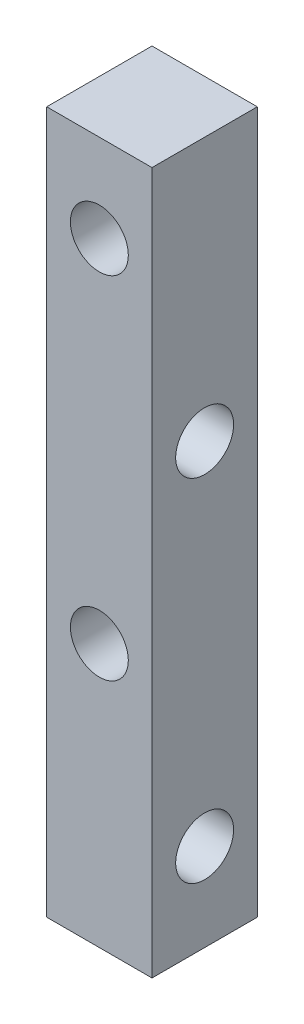
ISO-10303-21;
HEADER;
FILE_DESCRIPTION(('STEP AP214'),'2;1');
FILE_NAME('part.step','',(''),(''),'','','');
FILE_SCHEMA(('AUTOMOTIVE_DESIGN { 1 0 10303 214 1 1 1 1 }'));
ENDSEC;
DATA;
#1=APPLICATION_CONTEXT('core data for automotive mechanical design processes');
#2=APPLICATION_PROTOCOL_DEFINITION('international standard','automotive_design',2000,#1);
#3=PRODUCT_CONTEXT('',#1,'mechanical');
#4=PRODUCT('Part','Part','',(#3));
#5=PRODUCT_RELATED_PRODUCT_CATEGORY('part','',(#4));
#6=PRODUCT_DEFINITION_FORMATION('','',#4);
#7=PRODUCT_DEFINITION_CONTEXT('part definition',#1,'design');
#8=PRODUCT_DEFINITION('design','',#6,#7);
#9=PRODUCT_DEFINITION_SHAPE('','',#8);
#10=(LENGTH_UNIT() NAMED_UNIT(*) SI_UNIT(.MILLI.,.METRE.));
#11=(NAMED_UNIT(*) PLANE_ANGLE_UNIT() SI_UNIT($,.RADIAN.));
#12=(NAMED_UNIT(*) SI_UNIT($,.STERADIAN.) SOLID_ANGLE_UNIT());
#13=UNCERTAINTY_MEASURE_WITH_UNIT(LENGTH_MEASURE(1.E-05),#10,'distance_accuracy_value','');
#14=(GEOMETRIC_REPRESENTATION_CONTEXT(3) GLOBAL_UNCERTAINTY_ASSIGNED_CONTEXT((#13)) GLOBAL_UNIT_ASSIGNED_CONTEXT((#10,
#11,#12)) REPRESENTATION_CONTEXT('',''));
#15=CARTESIAN_POINT('',(0.,0.,0.));
#16=DIRECTION('',(0.,0.,1.));
#17=DIRECTION('',(1.,0.,0.));
#18=AXIS2_PLACEMENT_3D('',#15,#16,#17);
#19=CARTESIAN_POINT('',(3.,20.,-3.));
#20=DIRECTION('',(-1.,0.,0.));
#21=DIRECTION('',(0.,0.,1.));
#22=AXIS2_PLACEMENT_3D('',#19,#20,#21);
#23=PLANE('',#22);
#24=CARTESIAN_POINT('',(3.,5.,0.));
#25=DIRECTION('',(-1.,0.,0.));
#26=DIRECTION('',(0.,0.,1.));
#27=AXIS2_PLACEMENT_3D('',#24,#25,#26);
#28=CIRCLE('',#27,1.65);
#29=CARTESIAN_POINT('',(3.,5.,-1.65));
#30=VERTEX_POINT('',#29);
#31=EDGE_CURVE('E124',#30,#30,#28,.T.);
#32=ORIENTED_EDGE('',*,*,#31,.T.);
#33=EDGE_LOOP('',(#32));
#34=FACE_BOUND('',#33,.T.);
#35=CARTESIAN_POINT('',(3.,-15.,0.));
#36=DIRECTION('',(-1.,0.,0.));
#37=DIRECTION('',(0.,0.,1.));
#38=AXIS2_PLACEMENT_3D('',#35,#36,#37);
#39=CIRCLE('',#38,1.65);
#40=CARTESIAN_POINT('',(3.,-15.,-1.65));
#41=VERTEX_POINT('',#40);
#42=EDGE_CURVE('E129',#41,#41,#39,.T.);
#43=ORIENTED_EDGE('',*,*,#42,.T.);
#44=EDGE_LOOP('',(#43));
#45=FACE_BOUND('',#44,.T.);
#46=DIRECTION('',(0.,0.,-1.));
#47=VECTOR('',#46,1.);
#48=CARTESIAN_POINT('',(3.,-20.,-3.));
#49=LINE('',#48,#47);
#50=CARTESIAN_POINT('',(3.,-20.,3.));
#51=VERTEX_POINT('',#50);
#52=CARTESIAN_POINT('',(3.,-20.,-3.));
#53=VERTEX_POINT('',#52);
#54=EDGE_CURVE('E105',#51,#53,#49,.T.);
#55=ORIENTED_EDGE('',*,*,#54,.T.);
#56=DIRECTION('',(0.,-1.,0.));
#57=VECTOR('',#56,1.);
#58=CARTESIAN_POINT('',(3.,20.,-3.));
#59=LINE('',#58,#57);
#60=CARTESIAN_POINT('',(3.,20.,-3.));
#61=VERTEX_POINT('',#60);
#62=EDGE_CURVE('E11',#61,#53,#59,.T.);
#63=ORIENTED_EDGE('',*,*,#62,.F.);
#64=DIRECTION('',(0.,0.,-1.));
#65=VECTOR('',#64,1.);
#66=CARTESIAN_POINT('',(3.,20.,-3.));
#67=LINE('',#66,#65);
#68=CARTESIAN_POINT('',(3.,20.,3.));
#69=VERTEX_POINT('',#68);
#70=EDGE_CURVE('E92',#69,#61,#67,.T.);
#71=ORIENTED_EDGE('',*,*,#70,.F.);
#72=DIRECTION('',(0.,-1.,0.));
#73=VECTOR('',#72,1.);
#74=CARTESIAN_POINT('',(3.,20.,3.));
#75=LINE('',#74,#73);
#76=EDGE_CURVE('E101',#69,#51,#75,.T.);
#77=ORIENTED_EDGE('',*,*,#76,.T.);
#78=EDGE_LOOP('',(#55,#63,#71,#77));
#79=FACE_BOUND('',#78,.T.);
#80=ADVANCED_FACE('F39',(#34,#45,#79),#23,.F.);
#81=CARTESIAN_POINT('',(-3.,20.,-3.));
#82=DIRECTION('',(0.,0.,1.));
#83=DIRECTION('',(1.,0.,0.));
#84=AXIS2_PLACEMENT_3D('',#81,#82,#83);
#85=PLANE('',#84);
#86=CARTESIAN_POINT('',(0.,15.,-3.));
#87=DIRECTION('',(0.,0.,1.));
#88=DIRECTION('',(1.,0.,0.));
#89=AXIS2_PLACEMENT_3D('',#86,#87,#88);
#90=CIRCLE('',#89,1.65);
#91=CARTESIAN_POINT('',(1.65,15.,-3.));
#92=VERTEX_POINT('',#91);
#93=EDGE_CURVE('E114',#92,#92,#90,.T.);
#94=ORIENTED_EDGE('',*,*,#93,.T.);
#95=EDGE_LOOP('',(#94));
#96=FACE_BOUND('',#95,.T.);
#97=CARTESIAN_POINT('',(0.,-5.,-3.));
#98=DIRECTION('',(0.,0.,1.));
#99=DIRECTION('',(1.,0.,0.));
#100=AXIS2_PLACEMENT_3D('',#97,#98,#99);
#101=CIRCLE('',#100,1.65);
#102=CARTESIAN_POINT('',(1.65,-5.,-3.));
#103=VERTEX_POINT('',#102);
#104=EDGE_CURVE('E119',#103,#103,#101,.T.);
#105=ORIENTED_EDGE('',*,*,#104,.T.);
#106=EDGE_LOOP('',(#105));
#107=FACE_BOUND('',#106,.T.);
#108=DIRECTION('',(-1.,0.,0.));
#109=VECTOR('',#108,1.);
#110=CARTESIAN_POINT('',(-3.,-20.,-3.));
#111=LINE('',#110,#109);
#112=CARTESIAN_POINT('',(-3.,-20.,-3.));
#113=VERTEX_POINT('',#112);
#114=EDGE_CURVE('E96',#53,#113,#111,.T.);
#115=ORIENTED_EDGE('',*,*,#114,.T.);
#116=DIRECTION('',(0.,-1.,0.));
#117=VECTOR('',#116,1.);
#118=CARTESIAN_POINT('',(-3.,20.,-3.));
#119=LINE('',#118,#117);
#120=CARTESIAN_POINT('',(-3.,20.,-3.));
#121=VERTEX_POINT('',#120);
#122=EDGE_CURVE('E48',#121,#113,#119,.T.);
#123=ORIENTED_EDGE('',*,*,#122,.F.);
#124=DIRECTION('',(-1.,0.,0.));
#125=VECTOR('',#124,1.);
#126=CARTESIAN_POINT('',(-3.,20.,-3.));
#127=LINE('',#126,#125);
#128=EDGE_CURVE('E87',#61,#121,#127,.T.);
#129=ORIENTED_EDGE('',*,*,#128,.F.);
#130=ORIENTED_EDGE('',*,*,#62,.T.);
#131=EDGE_LOOP('',(#115,#123,#129,#130));
#132=FACE_BOUND('',#131,.T.);
#133=ADVANCED_FACE('F95',(#96,#107,#132),#85,.F.);
#134=CARTESIAN_POINT('',(-3.,20.,-3.));
#135=DIRECTION('',(1.,0.,0.));
#136=DIRECTION('',(0.,0.,-1.));
#137=AXIS2_PLACEMENT_3D('',#134,#135,#136);
#138=PLANE('',#137);
#139=CARTESIAN_POINT('',(-3.,5.,0.));
#140=DIRECTION('',(1.,0.,0.));
#141=DIRECTION('',(0.,0.,-1.));
#142=AXIS2_PLACEMENT_3D('',#139,#140,#141);
#143=CIRCLE('',#142,1.65);
#144=CARTESIAN_POINT('',(-3.,5.,-1.65));
#145=VERTEX_POINT('',#144);
#146=EDGE_CURVE('E132',#145,#145,#143,.T.);
#147=ORIENTED_EDGE('',*,*,#146,.T.);
#148=EDGE_LOOP('',(#147));
#149=FACE_BOUND('',#148,.T.);
#150=CARTESIAN_POINT('',(-3.,-15.,0.));
#151=DIRECTION('',(1.,0.,0.));
#152=DIRECTION('',(0.,0.,-1.));
#153=AXIS2_PLACEMENT_3D('',#150,#151,#152);
#154=CIRCLE('',#153,1.65);
#155=CARTESIAN_POINT('',(-3.,-15.,-1.65));
#156=VERTEX_POINT('',#155);
#157=EDGE_CURVE('E133',#156,#156,#154,.T.);
#158=ORIENTED_EDGE('',*,*,#157,.T.);
#159=EDGE_LOOP('',(#158));
#160=FACE_BOUND('',#159,.T.);
#161=DIRECTION('',(0.,0.,1.));
#162=VECTOR('',#161,1.);
#163=CARTESIAN_POINT('',(-3.,-20.,-3.));
#164=LINE('',#163,#162);
#165=CARTESIAN_POINT('',(-3.,-20.,3.));
#166=VERTEX_POINT('',#165);
#167=EDGE_CURVE('E74',#113,#166,#164,.T.);
#168=ORIENTED_EDGE('',*,*,#167,.T.);
#169=DIRECTION('',(0.,-1.,0.));
#170=VECTOR('',#169,1.);
#171=CARTESIAN_POINT('',(-3.,20.,3.));
#172=LINE('',#171,#170);
#173=CARTESIAN_POINT('',(-3.,20.,3.));
#174=VERTEX_POINT('',#173);
#175=EDGE_CURVE('E97',#174,#166,#172,.T.);
#176=ORIENTED_EDGE('',*,*,#175,.F.);
#177=DIRECTION('',(0.,0.,1.));
#178=VECTOR('',#177,1.);
#179=CARTESIAN_POINT('',(-3.,20.,-3.));
#180=LINE('',#179,#178);
#181=EDGE_CURVE('E90',#121,#174,#180,.T.);
#182=ORIENTED_EDGE('',*,*,#181,.F.);
#183=ORIENTED_EDGE('',*,*,#122,.T.);
#184=EDGE_LOOP('',(#168,#176,#182,#183));
#185=FACE_BOUND('',#184,.T.);
#186=ADVANCED_FACE('F99',(#149,#160,#185),#138,.F.);
#187=CARTESIAN_POINT('',(-3.,20.,3.));
#188=DIRECTION('',(0.,0.,-1.));
#189=DIRECTION('',(-1.,0.,0.));
#190=AXIS2_PLACEMENT_3D('',#187,#188,#189);
#191=PLANE('',#190);
#192=CARTESIAN_POINT('',(0.,15.,3.));
#193=DIRECTION('',(0.,0.,-1.));
#194=DIRECTION('',(-1.,0.,0.));
#195=AXIS2_PLACEMENT_3D('',#192,#193,#194);
#196=CIRCLE('',#195,1.65);
#197=CARTESIAN_POINT('',(-1.65,15.,3.));
#198=VERTEX_POINT('',#197);
#199=EDGE_CURVE('E42',#198,#198,#196,.T.);
#200=ORIENTED_EDGE('',*,*,#199,.T.);
#201=EDGE_LOOP('',(#200));
#202=FACE_BOUND('',#201,.T.);
#203=CARTESIAN_POINT('',(0.,-5.,3.));
#204=DIRECTION('',(0.,0.,-1.));
#205=DIRECTION('',(-1.,0.,0.));
#206=AXIS2_PLACEMENT_3D('',#203,#204,#205);
#207=CIRCLE('',#206,1.65);
#208=CARTESIAN_POINT('',(-1.65,-5.,3.));
#209=VERTEX_POINT('',#208);
#210=EDGE_CURVE('E112',#209,#209,#207,.T.);
#211=ORIENTED_EDGE('',*,*,#210,.T.);
#212=EDGE_LOOP('',(#211));
#213=FACE_BOUND('',#212,.T.);
#214=DIRECTION('',(1.,0.,0.));
#215=VECTOR('',#214,1.);
#216=CARTESIAN_POINT('',(-3.,-20.,3.));
#217=LINE('',#216,#215);
#218=EDGE_CURVE('E80',#166,#51,#217,.T.);
#219=ORIENTED_EDGE('',*,*,#218,.T.);
#220=ORIENTED_EDGE('',*,*,#76,.F.);
#221=DIRECTION('',(1.,0.,0.));
#222=VECTOR('',#221,1.);
#223=CARTESIAN_POINT('',(-3.,20.,3.));
#224=LINE('',#223,#222);
#225=EDGE_CURVE('E57',#174,#69,#224,.T.);
#226=ORIENTED_EDGE('',*,*,#225,.F.);
#227=ORIENTED_EDGE('',*,*,#175,.T.);
#228=EDGE_LOOP('',(#219,#220,#226,#227));
#229=FACE_BOUND('',#228,.T.);
#230=ADVANCED_FACE('F166',(#202,#213,#229),#191,.F.);
#231=CARTESIAN_POINT('',(0.,20.,0.));
#232=DIRECTION('',(0.,1.,0.));
#233=DIRECTION('',(0.,0.,1.));
#234=AXIS2_PLACEMENT_3D('',#231,#232,#233);
#235=PLANE('',#234);
#236=ORIENTED_EDGE('',*,*,#70,.T.);
#237=ORIENTED_EDGE('',*,*,#128,.T.);
#238=ORIENTED_EDGE('',*,*,#181,.T.);
#239=ORIENTED_EDGE('',*,*,#225,.T.);
#240=EDGE_LOOP('',(#236,#237,#238,#239));
#241=FACE_BOUND('',#240,.T.);
#242=ADVANCED_FACE('F88',(#241),#235,.T.);
#243=CARTESIAN_POINT('',(0.,-20.,0.));
#244=DIRECTION('',(0.,1.,0.));
#245=DIRECTION('',(0.,0.,1.));
#246=AXIS2_PLACEMENT_3D('',#243,#244,#245);
#247=PLANE('',#246);
#248=ORIENTED_EDGE('',*,*,#54,.F.);
#249=ORIENTED_EDGE('',*,*,#218,.F.);
#250=ORIENTED_EDGE('',*,*,#167,.F.);
#251=ORIENTED_EDGE('',*,*,#114,.F.);
#252=EDGE_LOOP('',(#248,#249,#250,#251));
#253=FACE_BOUND('',#252,.T.);
#254=ADVANCED_FACE('F154',(#253),#247,.F.);
#255=CARTESIAN_POINT('',(0.,-5.,-3.));
#256=DIRECTION('',(0.,0.,1.));
#257=DIRECTION('',(1.,0.,0.));
#258=AXIS2_PLACEMENT_3D('',#255,#256,#257);
#259=CYLINDRICAL_SURFACE('',#258,1.65);
#260=ORIENTED_EDGE('',*,*,#104,.F.);
#261=EDGE_LOOP('',(#260));
#262=FACE_BOUND('',#261,.T.);
#263=ORIENTED_EDGE('',*,*,#210,.F.);
#264=EDGE_LOOP('',(#263));
#265=FACE_BOUND('',#264,.T.);
#266=ADVANCED_FACE('F156',(#262,#265),#259,.F.);
#267=CARTESIAN_POINT('',(0.,15.,-3.));
#268=DIRECTION('',(0.,0.,1.));
#269=DIRECTION('',(1.,0.,0.));
#270=AXIS2_PLACEMENT_3D('',#267,#268,#269);
#271=CYLINDRICAL_SURFACE('',#270,1.65);
#272=ORIENTED_EDGE('',*,*,#93,.F.);
#273=EDGE_LOOP('',(#272));
#274=FACE_BOUND('',#273,.T.);
#275=ORIENTED_EDGE('',*,*,#199,.F.);
#276=EDGE_LOOP('',(#275));
#277=FACE_BOUND('',#276,.T.);
#278=ADVANCED_FACE('F163',(#274,#277),#271,.F.);
#279=CARTESIAN_POINT('',(-3.,-15.,0.));
#280=DIRECTION('',(1.,0.,0.));
#281=DIRECTION('',(0.,0.,-1.));
#282=AXIS2_PLACEMENT_3D('',#279,#280,#281);
#283=CYLINDRICAL_SURFACE('',#282,1.65);
#284=CARTESIAN_POINT('',(-3.,-15.,-1.65));
#285=CARTESIAN_POINT('',(-2.9375,-15.,-1.65));
#286=CARTESIAN_POINT('',(-2.875,-15.,-1.65));
#287=CARTESIAN_POINT('',(-2.75,-15.,-1.65));
#288=CARTESIAN_POINT('',(-2.6875,-15.,-1.65));
#289=CARTESIAN_POINT('',(-2.5625,-15.,-1.65));
#290=CARTESIAN_POINT('',(-2.5,-15.,-1.65));
#291=CARTESIAN_POINT('',(-2.375,-15.,-1.65));
#292=CARTESIAN_POINT('',(-2.3125,-15.,-1.65));
#293=CARTESIAN_POINT('',(-2.1875,-15.,-1.65));
#294=CARTESIAN_POINT('',(-2.125,-15.,-1.65));
#295=CARTESIAN_POINT('',(-2.,-15.,-1.65));
#296=CARTESIAN_POINT('',(-1.9375,-15.,-1.65));
#297=CARTESIAN_POINT('',(-1.8125,-15.,-1.65));
#298=CARTESIAN_POINT('',(-1.75,-15.,-1.65));
#299=CARTESIAN_POINT('',(-1.625,-15.,-1.65));
#300=CARTESIAN_POINT('',(-1.5625,-15.,-1.65));
#301=CARTESIAN_POINT('',(-1.4375,-15.,-1.65));
#302=CARTESIAN_POINT('',(-1.375,-15.,-1.65));
#303=CARTESIAN_POINT('',(-1.25,-15.,-1.65));
#304=CARTESIAN_POINT('',(-1.1875,-15.,-1.65));
#305=CARTESIAN_POINT('',(-1.0625,-15.,-1.65));
#306=CARTESIAN_POINT('',(-1.,-15.,-1.65));
#307=CARTESIAN_POINT('',(-0.875000000000001,-15.,-1.65));
#308=CARTESIAN_POINT('',(-0.812500000000001,-15.,-1.65));
#309=CARTESIAN_POINT('',(-0.687500000000001,-15.,-1.65));
#310=CARTESIAN_POINT('',(-0.625000000000001,-15.,-1.65));
#311=CARTESIAN_POINT('',(-0.500000000000001,-15.,-1.65));
#312=CARTESIAN_POINT('',(-0.437500000000001,-15.,-1.65));
#313=CARTESIAN_POINT('',(-0.312500000000001,-15.,-1.65));
#314=CARTESIAN_POINT('',(-0.250000000000001,-15.,-1.65));
#315=CARTESIAN_POINT('',(-0.125000000000001,-15.,-1.65));
#316=CARTESIAN_POINT('',(-0.0625000000000013,-15.,-1.65));
#317=CARTESIAN_POINT('',(0.0624999999999987,-15.,-1.65));
#318=CARTESIAN_POINT('',(0.124999999999999,-15.,-1.65));
#319=CARTESIAN_POINT('',(0.249999999999999,-15.,-1.65));
#320=CARTESIAN_POINT('',(0.312499999999999,-15.,-1.65));
#321=CARTESIAN_POINT('',(0.437499999999999,-15.,-1.65));
#322=CARTESIAN_POINT('',(0.499999999999999,-15.,-1.65));
#323=CARTESIAN_POINT('',(0.624999999999999,-15.,-1.65));
#324=CARTESIAN_POINT('',(0.687499999999999,-15.,-1.65));
#325=CARTESIAN_POINT('',(0.812499999999998,-15.,-1.65));
#326=CARTESIAN_POINT('',(0.874999999999998,-15.,-1.65));
#327=CARTESIAN_POINT('',(0.999999999999998,-15.,-1.65));
#328=CARTESIAN_POINT('',(1.0625,-15.,-1.65));
#329=CARTESIAN_POINT('',(1.1875,-15.,-1.65));
#330=CARTESIAN_POINT('',(1.25,-15.,-1.65));
#331=CARTESIAN_POINT('',(1.375,-15.,-1.65));
#332=CARTESIAN_POINT('',(1.4375,-15.,-1.65));
#333=CARTESIAN_POINT('',(1.5625,-15.,-1.65));
#334=CARTESIAN_POINT('',(1.625,-15.,-1.65));
#335=CARTESIAN_POINT('',(1.75,-15.,-1.65));
#336=CARTESIAN_POINT('',(1.8125,-15.,-1.65));
#337=CARTESIAN_POINT('',(1.9375,-15.,-1.65));
#338=CARTESIAN_POINT('',(2.,-15.,-1.65));
#339=CARTESIAN_POINT('',(2.125,-15.,-1.65));
#340=CARTESIAN_POINT('',(2.1875,-15.,-1.65));
#341=CARTESIAN_POINT('',(2.3125,-15.,-1.65));
#342=CARTESIAN_POINT('',(2.375,-15.,-1.65));
#343=CARTESIAN_POINT('',(2.5,-15.,-1.65));
#344=CARTESIAN_POINT('',(2.5625,-15.,-1.65));
#345=CARTESIAN_POINT('',(2.6875,-15.,-1.65));
#346=CARTESIAN_POINT('',(2.75,-15.,-1.65));
#347=CARTESIAN_POINT('',(2.875,-15.,-1.65));
#348=CARTESIAN_POINT('',(2.9375,-15.,-1.65));
#349=CARTESIAN_POINT('',(3.,-15.,-1.65));
#350=B_SPLINE_CURVE_WITH_KNOTS('',3,(#284,#285,#286,#287,#288,#289,#290,#291,#292,#293,#294,
#295,#296,#297,#298,#299,#300,#301,#302,#303,#304,#305,#306,#307,#308,#309,#310,#311,#312,#313,
#314,#315,#316,#317,#318,#319,#320,#321,#322,#323,#324,#325,#326,#327,#328,#329,#330,#331,#332,
#333,#334,#335,#336,#337,#338,#339,#340,#341,#342,#343,#344,#345,#346,#347,#348,#349),
.UNSPECIFIED.,.F.,.F.,(4,2,2,2,2,2,2,2,2,2,2,2,2,2,2,2,2,2,2,2,2,2,2,2,2,2,2,2,2,2,2,2,4),(0.,
0.1875,0.375,0.5625,0.75,0.9375,1.125,1.3125,1.5,1.6875,1.875,2.0625,2.25,2.4375,2.625,2.8125,
3.,3.1875,3.375,3.5625,3.75,3.9375,4.125,4.3125,4.5,4.6875,4.875,5.0625,5.25,5.4375,5.625,
5.8125,6.),.UNSPECIFIED.);
#351=EDGE_CURVE('BSEAM144',#156,#41,#350,.T.);
#352=ORIENTED_EDGE('',*,*,#157,.F.);
#353=ORIENTED_EDGE('',*,*,#42,.F.);
#354=ORIENTED_EDGE('',*,*,#351,.T.);
#355=ORIENTED_EDGE('',*,*,#351,.F.);
#356=EDGE_LOOP('',(#352,#354,#353,#355));
#357=FACE_BOUND('',#356,.T.);
#358=ADVANCED_FACE('F144',(#357),#283,.F.);
#359=CARTESIAN_POINT('',(-3.,5.,0.));
#360=DIRECTION('',(1.,0.,0.));
#361=DIRECTION('',(0.,0.,-1.));
#362=AXIS2_PLACEMENT_3D('',#359,#360,#361);
#363=CYLINDRICAL_SURFACE('',#362,1.65);
#364=CARTESIAN_POINT('',(-3.,5.,-1.65));
#365=CARTESIAN_POINT('',(-2.9375,5.,-1.65));
#366=CARTESIAN_POINT('',(-2.875,5.,-1.65));
#367=CARTESIAN_POINT('',(-2.75,5.,-1.65));
#368=CARTESIAN_POINT('',(-2.6875,5.,-1.65));
#369=CARTESIAN_POINT('',(-2.5625,5.,-1.65));
#370=CARTESIAN_POINT('',(-2.5,5.,-1.65));
#371=CARTESIAN_POINT('',(-2.375,5.,-1.65));
#372=CARTESIAN_POINT('',(-2.3125,5.,-1.65));
#373=CARTESIAN_POINT('',(-2.1875,5.,-1.65));
#374=CARTESIAN_POINT('',(-2.125,5.,-1.65));
#375=CARTESIAN_POINT('',(-2.,5.,-1.65));
#376=CARTESIAN_POINT('',(-1.9375,5.,-1.65));
#377=CARTESIAN_POINT('',(-1.8125,5.,-1.65));
#378=CARTESIAN_POINT('',(-1.75,5.,-1.65));
#379=CARTESIAN_POINT('',(-1.625,5.,-1.65));
#380=CARTESIAN_POINT('',(-1.5625,5.,-1.65));
#381=CARTESIAN_POINT('',(-1.4375,5.,-1.65));
#382=CARTESIAN_POINT('',(-1.375,5.,-1.65));
#383=CARTESIAN_POINT('',(-1.25,5.,-1.65));
#384=CARTESIAN_POINT('',(-1.1875,5.,-1.65));
#385=CARTESIAN_POINT('',(-1.0625,5.,-1.65));
#386=CARTESIAN_POINT('',(-1.,5.,-1.65));
#387=CARTESIAN_POINT('',(-0.875000000000001,5.,-1.65));
#388=CARTESIAN_POINT('',(-0.812500000000001,5.,-1.65));
#389=CARTESIAN_POINT('',(-0.687500000000001,5.,-1.65));
#390=CARTESIAN_POINT('',(-0.625000000000001,5.,-1.65));
#391=CARTESIAN_POINT('',(-0.500000000000001,5.,-1.65));
#392=CARTESIAN_POINT('',(-0.437500000000001,5.,-1.65));
#393=CARTESIAN_POINT('',(-0.312500000000001,5.,-1.65));
#394=CARTESIAN_POINT('',(-0.250000000000001,5.,-1.65));
#395=CARTESIAN_POINT('',(-0.125000000000001,5.,-1.65));
#396=CARTESIAN_POINT('',(-0.0625000000000013,5.,-1.65));
#397=CARTESIAN_POINT('',(0.0624999999999987,5.,-1.65));
#398=CARTESIAN_POINT('',(0.124999999999999,5.,-1.65));
#399=CARTESIAN_POINT('',(0.249999999999999,5.,-1.65));
#400=CARTESIAN_POINT('',(0.312499999999999,5.,-1.65));
#401=CARTESIAN_POINT('',(0.437499999999999,5.,-1.65));
#402=CARTESIAN_POINT('',(0.499999999999999,5.,-1.65));
#403=CARTESIAN_POINT('',(0.624999999999999,5.,-1.65));
#404=CARTESIAN_POINT('',(0.687499999999999,5.,-1.65));
#405=CARTESIAN_POINT('',(0.812499999999998,5.,-1.65));
#406=CARTESIAN_POINT('',(0.874999999999998,5.,-1.65));
#407=CARTESIAN_POINT('',(0.999999999999998,5.,-1.65));
#408=CARTESIAN_POINT('',(1.0625,5.,-1.65));
#409=CARTESIAN_POINT('',(1.1875,5.,-1.65));
#410=CARTESIAN_POINT('',(1.25,5.,-1.65));
#411=CARTESIAN_POINT('',(1.375,5.,-1.65));
#412=CARTESIAN_POINT('',(1.4375,5.,-1.65));
#413=CARTESIAN_POINT('',(1.5625,5.,-1.65));
#414=CARTESIAN_POINT('',(1.625,5.,-1.65));
#415=CARTESIAN_POINT('',(1.75,5.,-1.65));
#416=CARTESIAN_POINT('',(1.8125,5.,-1.65));
#417=CARTESIAN_POINT('',(1.9375,5.,-1.65));
#418=CARTESIAN_POINT('',(2.,5.,-1.65));
#419=CARTESIAN_POINT('',(2.125,5.,-1.65));
#420=CARTESIAN_POINT('',(2.1875,5.,-1.65));
#421=CARTESIAN_POINT('',(2.3125,5.,-1.65));
#422=CARTESIAN_POINT('',(2.375,5.,-1.65));
#423=CARTESIAN_POINT('',(2.5,5.,-1.65));
#424=CARTESIAN_POINT('',(2.5625,5.,-1.65));
#425=CARTESIAN_POINT('',(2.6875,5.,-1.65));
#426=CARTESIAN_POINT('',(2.75,5.,-1.65));
#427=CARTESIAN_POINT('',(2.875,5.,-1.65));
#428=CARTESIAN_POINT('',(2.9375,5.,-1.65));
#429=CARTESIAN_POINT('',(3.,5.,-1.65));
#430=B_SPLINE_CURVE_WITH_KNOTS('',3,(#364,#365,#366,#367,#368,#369,#370,#371,#372,#373,#374,
#375,#376,#377,#378,#379,#380,#381,#382,#383,#384,#385,#386,#387,#388,#389,#390,#391,#392,#393,
#394,#395,#396,#397,#398,#399,#400,#401,#402,#403,#404,#405,#406,#407,#408,#409,#410,#411,#412,
#413,#414,#415,#416,#417,#418,#419,#420,#421,#422,#423,#424,#425,#426,#427,#428,#429),
.UNSPECIFIED.,.F.,.F.,(4,2,2,2,2,2,2,2,2,2,2,2,2,2,2,2,2,2,2,2,2,2,2,2,2,2,2,2,2,2,2,2,4),(0.,
0.1875,0.375,0.5625,0.75,0.9375,1.125,1.3125,1.5,1.6875,1.875,2.0625,2.25,2.4375,2.625,2.8125,
3.,3.1875,3.375,3.5625,3.75,3.9375,4.125,4.3125,4.5,4.6875,4.875,5.0625,5.25,5.4375,5.625,
5.8125,6.),.UNSPECIFIED.);
#431=EDGE_CURVE('BSEAM141',#145,#30,#430,.T.);
#432=ORIENTED_EDGE('',*,*,#146,.F.);
#433=ORIENTED_EDGE('',*,*,#31,.F.);
#434=ORIENTED_EDGE('',*,*,#431,.T.);
#435=ORIENTED_EDGE('',*,*,#431,.F.);
#436=EDGE_LOOP('',(#432,#434,#433,#435));
#437=FACE_BOUND('',#436,.T.);
#438=ADVANCED_FACE('F141',(#437),#363,.F.);
#439=CLOSED_SHELL('',(#80,#133,#186,#230,#242,#254,#266,#278,#358,#438));
#440=MANIFOLD_SOLID_BREP('B2',#439);
#441=ADVANCED_BREP_SHAPE_REPRESENTATION('',(#18,#440),#14);
#442=SHAPE_DEFINITION_REPRESENTATION(#9,#441);
ENDSEC;
END-ISO-10303-21;
